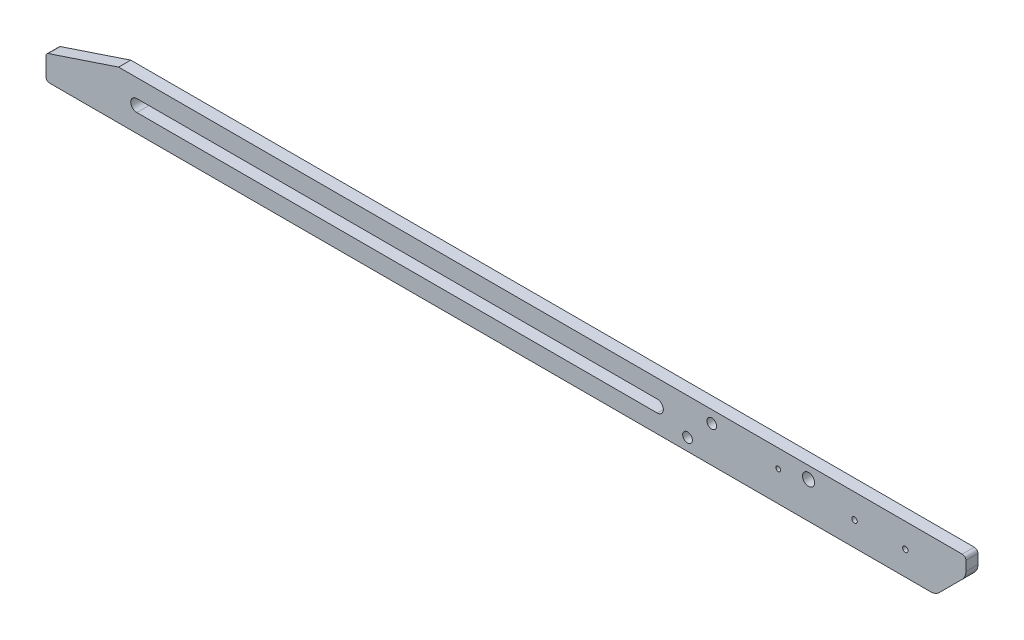
ISO-10303-21;
HEADER;
FILE_DESCRIPTION(('STEP AP214'),'2;1');
FILE_NAME('part.step','',(''),(''),'','','');
FILE_SCHEMA(('AUTOMOTIVE_DESIGN { 1 0 10303 214 1 1 1 1 }'));
ENDSEC;
DATA;
#1=APPLICATION_CONTEXT('core data for automotive mechanical design processes');
#2=APPLICATION_PROTOCOL_DEFINITION('international standard','automotive_design',2000,#1);
#3=PRODUCT_CONTEXT('',#1,'mechanical');
#4=PRODUCT('Part','Part','',(#3));
#5=PRODUCT_RELATED_PRODUCT_CATEGORY('part','',(#4));
#6=PRODUCT_DEFINITION_FORMATION('','',#4);
#7=PRODUCT_DEFINITION_CONTEXT('part definition',#1,'design');
#8=PRODUCT_DEFINITION('design','',#6,#7);
#9=PRODUCT_DEFINITION_SHAPE('','',#8);
#10=(LENGTH_UNIT() NAMED_UNIT(*) SI_UNIT(.MILLI.,.METRE.));
#11=(NAMED_UNIT(*) PLANE_ANGLE_UNIT() SI_UNIT($,.RADIAN.));
#12=(NAMED_UNIT(*) SI_UNIT($,.STERADIAN.) SOLID_ANGLE_UNIT());
#13=UNCERTAINTY_MEASURE_WITH_UNIT(LENGTH_MEASURE(1.E-05),#10,'distance_accuracy_value','');
#14=(GEOMETRIC_REPRESENTATION_CONTEXT(3) GLOBAL_UNCERTAINTY_ASSIGNED_CONTEXT((#13)) GLOBAL_UNIT_ASSIGNED_CONTEXT((#10,
#11,#12)) REPRESENTATION_CONTEXT('',''));
#15=CARTESIAN_POINT('',(0.,0.,0.));
#16=DIRECTION('',(0.,0.,1.));
#17=DIRECTION('',(1.,0.,0.));
#18=AXIS2_PLACEMENT_3D('',#15,#16,#17);
#19=CARTESIAN_POINT('',(0.,0.,10.));
#20=DIRECTION('',(1.,0.,0.));
#21=DIRECTION('',(0.,0.,-1.));
#22=AXIS2_PLACEMENT_3D('',#19,#20,#21);
#23=PLANE('',#22);
#24=DIRECTION('',(0.,-1.,0.));
#25=VECTOR('',#24,1.);
#26=CARTESIAN_POINT('',(0.,0.,0.));
#27=LINE('',#26,#25);
#28=CARTESIAN_POINT('',(0.,17.8377223398316,0.));
#29=VERTEX_POINT('',#28);
#30=CARTESIAN_POINT('',(0.,3.,0.));
#31=VERTEX_POINT('',#30);
#32=EDGE_CURVE('E186',#29,#31,#27,.T.);
#33=ORIENTED_EDGE('',*,*,#32,.T.);
#34=DIRECTION('',(0.,0.,-1.));
#35=VECTOR('',#34,1.);
#36=CARTESIAN_POINT('',(0.,3.,10.));
#37=LINE('',#36,#35);
#38=CARTESIAN_POINT('',(0.,3.,10.));
#39=VERTEX_POINT('',#38);
#40=EDGE_CURVE('E314',#31,#39,#37,.F.);
#41=ORIENTED_EDGE('',*,*,#40,.T.);
#42=DIRECTION('',(0.,-1.,0.));
#43=VECTOR('',#42,1.);
#44=CARTESIAN_POINT('',(0.,0.,10.));
#45=LINE('',#44,#43);
#46=CARTESIAN_POINT('',(0.,17.8377223398316,10.));
#47=VERTEX_POINT('',#46);
#48=EDGE_CURVE('E189',#47,#39,#45,.T.);
#49=ORIENTED_EDGE('',*,*,#48,.F.);
#50=DIRECTION('',(0.,0.,1.));
#51=VECTOR('',#50,1.);
#52=CARTESIAN_POINT('',(0.,17.8377223398316,10.));
#53=LINE('',#52,#51);
#54=EDGE_CURVE('E312',#47,#29,#53,.F.);
#55=ORIENTED_EDGE('',*,*,#54,.T.);
#56=EDGE_LOOP('',(#33,#41,#49,#55));
#57=FACE_BOUND('',#56,.T.);
#58=ADVANCED_FACE('F35',(#57),#23,.F.);
#59=CARTESIAN_POINT('',(0.,0.,10.));
#60=DIRECTION('',(0.,1.,0.));
#61=DIRECTION('',(0.,0.,1.));
#62=AXIS2_PLACEMENT_3D('',#59,#60,#61);
#63=PLANE('',#62);
#64=DIRECTION('',(1.,0.,0.));
#65=VECTOR('',#64,1.);
#66=CARTESIAN_POINT('',(0.,0.,0.));
#67=LINE('',#66,#65);
#68=CARTESIAN_POINT('',(3.,0.,0.));
#69=VERTEX_POINT('',#68);
#70=CARTESIAN_POINT('',(730.857864376269,0.,0.));
#71=VERTEX_POINT('',#70);
#72=EDGE_CURVE('E235',#69,#71,#67,.T.);
#73=ORIENTED_EDGE('',*,*,#72,.T.);
#74=DIRECTION('',(0.,0.,-1.));
#75=VECTOR('',#74,1.);
#76=CARTESIAN_POINT('',(730.857864376269,0.,10.));
#77=LINE('',#76,#75);
#78=CARTESIAN_POINT('',(730.857864376269,0.,10.));
#79=VERTEX_POINT('',#78);
#80=EDGE_CURVE('E220',#71,#79,#77,.F.);
#81=ORIENTED_EDGE('',*,*,#80,.T.);
#82=DIRECTION('',(1.,0.,0.));
#83=VECTOR('',#82,1.);
#84=CARTESIAN_POINT('',(0.,0.,10.));
#85=LINE('',#84,#83);
#86=CARTESIAN_POINT('',(3.,0.,10.));
#87=VERTEX_POINT('',#86);
#88=EDGE_CURVE('E192',#87,#79,#85,.T.);
#89=ORIENTED_EDGE('',*,*,#88,.F.);
#90=DIRECTION('',(0.,0.,-1.));
#91=VECTOR('',#90,1.);
#92=CARTESIAN_POINT('',(3.,0.,10.));
#93=LINE('',#92,#91);
#94=EDGE_CURVE('E244',#87,#69,#93,.T.);
#95=ORIENTED_EDGE('',*,*,#94,.T.);
#96=EDGE_LOOP('',(#73,#81,#89,#95));
#97=FACE_BOUND('',#96,.T.);
#98=ADVANCED_FACE('F241',(#97),#63,.F.);
#99=CARTESIAN_POINT('',(760.,0.,10.));
#100=DIRECTION('',(-1.,0.,0.));
#101=DIRECTION('',(0.,0.,1.));
#102=AXIS2_PLACEMENT_3D('',#99,#100,#101);
#103=PLANE('',#102);
#104=DIRECTION('',(0.,1.,0.));
#105=VECTOR('',#104,1.);
#106=CARTESIAN_POINT('',(760.,0.,10.));
#107=LINE('',#106,#105);
#108=CARTESIAN_POINT('',(760.,29.1421356237311,10.));
#109=VERTEX_POINT('',#108);
#110=CARTESIAN_POINT('',(760.,37.,10.));
#111=VERTEX_POINT('',#110);
#112=EDGE_CURVE('E196',#109,#111,#107,.T.);
#113=ORIENTED_EDGE('',*,*,#112,.F.);
#114=DIRECTION('',(0.,0.,1.));
#115=VECTOR('',#114,1.);
#116=CARTESIAN_POINT('',(760.,29.1421356237311,0.));
#117=LINE('',#116,#115);
#118=CARTESIAN_POINT('',(760.,29.1421356237311,0.));
#119=VERTEX_POINT('',#118);
#120=EDGE_CURVE('E11',#109,#119,#117,.F.);
#121=ORIENTED_EDGE('',*,*,#120,.T.);
#122=DIRECTION('',(0.,1.,0.));
#123=VECTOR('',#122,1.);
#124=CARTESIAN_POINT('',(760.,0.,0.));
#125=LINE('',#124,#123);
#126=CARTESIAN_POINT('',(760.,37.,0.));
#127=VERTEX_POINT('',#126);
#128=EDGE_CURVE('E245',#119,#127,#125,.T.);
#129=ORIENTED_EDGE('',*,*,#128,.T.);
#130=DIRECTION('',(0.,0.,-1.));
#131=VECTOR('',#130,1.);
#132=CARTESIAN_POINT('',(760.,37.,10.));
#133=LINE('',#132,#131);
#134=EDGE_CURVE('E215',#127,#111,#133,.F.);
#135=ORIENTED_EDGE('',*,*,#134,.T.);
#136=EDGE_LOOP('',(#113,#121,#129,#135));
#137=FACE_BOUND('',#136,.T.);
#138=ADVANCED_FACE('F342',(#137),#103,.F.);
#139=CARTESIAN_POINT('',(0.,40.,10.));
#140=DIRECTION('',(0.,-1.,0.));
#141=DIRECTION('',(0.,0.,-1.));
#142=AXIS2_PLACEMENT_3D('',#139,#140,#141);
#143=PLANE('',#142);
#144=DIRECTION('',(-1.,0.,0.));
#145=VECTOR('',#144,1.);
#146=CARTESIAN_POINT('',(0.,40.,10.));
#147=LINE('',#146,#145);
#148=CARTESIAN_POINT('',(757.,40.,10.));
#149=VERTEX_POINT('',#148);
#150=CARTESIAN_POINT('',(60.,40.,10.));
#151=VERTEX_POINT('',#150);
#152=EDGE_CURVE('E198',#149,#151,#147,.T.);
#153=ORIENTED_EDGE('',*,*,#152,.F.);
#154=DIRECTION('',(0.,0.,-1.));
#155=VECTOR('',#154,1.);
#156=CARTESIAN_POINT('',(757.,40.,10.));
#157=LINE('',#156,#155);
#158=CARTESIAN_POINT('',(757.,40.,0.));
#159=VERTEX_POINT('',#158);
#160=EDGE_CURVE('E208',#149,#159,#157,.T.);
#161=ORIENTED_EDGE('',*,*,#160,.T.);
#162=DIRECTION('',(-1.,0.,0.));
#163=VECTOR('',#162,1.);
#164=CARTESIAN_POINT('',(0.,40.,0.));
#165=LINE('',#164,#163);
#166=CARTESIAN_POINT('',(60.,40.,0.));
#167=VERTEX_POINT('',#166);
#168=EDGE_CURVE('E193',#159,#167,#165,.T.);
#169=ORIENTED_EDGE('',*,*,#168,.T.);
#170=DIRECTION('',(0.,0.,1.));
#171=VECTOR('',#170,1.);
#172=CARTESIAN_POINT('',(60.,40.,0.));
#173=LINE('',#172,#171);
#174=EDGE_CURVE('E178',#167,#151,#173,.T.);
#175=ORIENTED_EDGE('',*,*,#174,.T.);
#176=EDGE_LOOP('',(#153,#161,#169,#175));
#177=FACE_BOUND('',#176,.T.);
#178=ADVANCED_FACE('F333',(#177),#143,.F.);
#179=CARTESIAN_POINT('',(0.,0.,10.));
#180=DIRECTION('',(0.,0.,-1.));
#181=DIRECTION('',(-1.,0.,0.));
#182=AXIS2_PLACEMENT_3D('',#179,#180,#181);
#183=PLANE('',#182);
#184=CARTESIAN_POINT('',(710.,20.,10.));
#185=DIRECTION('',(0.,0.,-1.));
#186=DIRECTION('',(-1.,0.,0.));
#187=AXIS2_PLACEMENT_3D('',#184,#185,#186);
#188=CIRCLE('',#187,2.25000000000001);
#189=CARTESIAN_POINT('',(707.75,20.,10.));
#190=VERTEX_POINT('',#189);
#191=EDGE_CURVE('E275',#190,#190,#188,.T.);
#192=ORIENTED_EDGE('',*,*,#191,.T.);
#193=EDGE_LOOP('',(#192));
#194=FACE_BOUND('',#193,.T.);
#195=CARTESIAN_POINT('',(668.,20.,10.));
#196=DIRECTION('',(0.,0.,-1.));
#197=DIRECTION('',(-1.,0.,0.));
#198=AXIS2_PLACEMENT_3D('',#195,#196,#197);
#199=CIRCLE('',#198,2.25000000000001);
#200=CARTESIAN_POINT('',(665.75,20.,10.));
#201=VERTEX_POINT('',#200);
#202=EDGE_CURVE('E264',#201,#201,#199,.T.);
#203=ORIENTED_EDGE('',*,*,#202,.T.);
#204=EDGE_LOOP('',(#203));
#205=FACE_BOUND('',#204,.T.);
#206=CARTESIAN_POINT('',(630.,30.,10.));
#207=DIRECTION('',(0.,0.,-1.));
#208=DIRECTION('',(-1.,0.,0.));
#209=AXIS2_PLACEMENT_3D('',#206,#207,#208);
#210=CIRCLE('',#209,5.00000000000005);
#211=CARTESIAN_POINT('',(625.,30.,10.));
#212=VERTEX_POINT('',#211);
#213=EDGE_CURVE('E261',#212,#212,#210,.T.);
#214=ORIENTED_EDGE('',*,*,#213,.T.);
#215=EDGE_LOOP('',(#214));
#216=FACE_BOUND('',#215,.T.);
#217=CARTESIAN_POINT('',(605.,25.,10.));
#218=DIRECTION('',(0.,0.,-1.));
#219=DIRECTION('',(-1.,0.,0.));
#220=AXIS2_PLACEMENT_3D('',#217,#218,#219);
#221=CIRCLE('',#220,2.);
#222=CARTESIAN_POINT('',(603.,25.,10.));
#223=VERTEX_POINT('',#222);
#224=EDGE_CURVE('E258',#223,#223,#221,.T.);
#225=ORIENTED_EDGE('',*,*,#224,.T.);
#226=EDGE_LOOP('',(#225));
#227=FACE_BOUND('',#226,.T.);
#228=CARTESIAN_POINT('',(550.,30.,10.));
#229=DIRECTION('',(0.,0.,-1.));
#230=DIRECTION('',(-1.,0.,0.));
#231=AXIS2_PLACEMENT_3D('',#228,#229,#230);
#232=CIRCLE('',#231,3.99999999999999);
#233=CARTESIAN_POINT('',(546.,30.,10.));
#234=VERTEX_POINT('',#233);
#235=EDGE_CURVE('E283',#234,#234,#232,.T.);
#236=ORIENTED_EDGE('',*,*,#235,.T.);
#237=EDGE_LOOP('',(#236));
#238=FACE_BOUND('',#237,.T.);
#239=CARTESIAN_POINT('',(530.,10.,10.));
#240=DIRECTION('',(0.,0.,-1.));
#241=DIRECTION('',(-1.,0.,0.));
#242=AXIS2_PLACEMENT_3D('',#239,#240,#241);
#243=CIRCLE('',#242,3.99999999999999);
#244=CARTESIAN_POINT('',(526.,10.,10.));
#245=VERTEX_POINT('',#244);
#246=EDGE_CURVE('E279',#245,#245,#243,.T.);
#247=ORIENTED_EDGE('',*,*,#246,.T.);
#248=EDGE_LOOP('',(#247));
#249=FACE_BOUND('',#248,.T.);
#250=DIRECTION('',(-1.,0.,0.));
#251=VECTOR('',#250,1.);
#252=CARTESIAN_POINT('',(0.,15.,10.));
#253=LINE('',#252,#251);
#254=CARTESIAN_POINT('',(505.,15.0000000000001,10.));
#255=VERTEX_POINT('',#254);
#256=CARTESIAN_POINT('',(75.,15.,10.));
#257=VERTEX_POINT('',#256);
#258=EDGE_CURVE('E144',#255,#257,#253,.T.);
#259=ORIENTED_EDGE('',*,*,#258,.T.);
#260=CARTESIAN_POINT('',(75.,20.,10.));
#261=DIRECTION('',(0.,0.,-1.));
#262=DIRECTION('',(-1.,0.,0.));
#263=AXIS2_PLACEMENT_3D('',#260,#261,#262);
#264=CIRCLE('',#263,5.);
#265=CARTESIAN_POINT('',(75.,25.,10.));
#266=VERTEX_POINT('',#265);
#267=EDGE_CURVE('E170',#257,#266,#264,.T.);
#268=ORIENTED_EDGE('',*,*,#267,.T.);
#269=DIRECTION('',(1.,0.,0.));
#270=VECTOR('',#269,1.);
#271=CARTESIAN_POINT('',(0.,25.,10.));
#272=LINE('',#271,#270);
#273=CARTESIAN_POINT('',(505.,25.0000000000001,10.));
#274=VERTEX_POINT('',#273);
#275=EDGE_CURVE('E168',#266,#274,#272,.T.);
#276=ORIENTED_EDGE('',*,*,#275,.T.);
#277=CARTESIAN_POINT('',(505.,20.0000000000001,10.));
#278=DIRECTION('',(0.,0.,-1.));
#279=DIRECTION('',(-1.,0.,0.));
#280=AXIS2_PLACEMENT_3D('',#277,#278,#279);
#281=CIRCLE('',#280,5.);
#282=EDGE_CURVE('E155',#274,#255,#281,.T.);
#283=ORIENTED_EDGE('',*,*,#282,.T.);
#284=EDGE_LOOP('',(#259,#268,#276,#283));
#285=FACE_BOUND('',#284,.T.);
#286=ORIENTED_EDGE('',*,*,#88,.T.);
#287=CARTESIAN_POINT('',(730.857864376269,10.,10.));
#288=DIRECTION('',(0.,0.,-1.));
#289=DIRECTION('',(-1.,0.,0.));
#290=AXIS2_PLACEMENT_3D('',#287,#288,#289);
#291=CIRCLE('',#290,10.);
#292=CARTESIAN_POINT('',(737.928932188134,2.9289321881345,10.));
#293=VERTEX_POINT('',#292);
#294=EDGE_CURVE('E225',#79,#293,#291,.F.);
#295=ORIENTED_EDGE('',*,*,#294,.T.);
#296=DIRECTION('',(-0.707106781186548,-0.707106781186548,0.));
#297=VECTOR('',#296,1.);
#298=CARTESIAN_POINT('',(760.,25.0000000000001,10.));
#299=LINE('',#298,#297);
#300=CARTESIAN_POINT('',(757.071067811866,22.0710678118656,10.));
#301=VERTEX_POINT('',#300);
#302=EDGE_CURVE('E212',#293,#301,#299,.F.);
#303=ORIENTED_EDGE('',*,*,#302,.T.);
#304=CARTESIAN_POINT('',(750.,29.1421356237311,10.));
#305=DIRECTION('',(0.,0.,-1.));
#306=DIRECTION('',(-1.,0.,0.));
#307=AXIS2_PLACEMENT_3D('',#304,#305,#306);
#308=CIRCLE('',#307,10.);
#309=EDGE_CURVE('E223',#301,#109,#308,.F.);
#310=ORIENTED_EDGE('',*,*,#309,.T.);
#311=ORIENTED_EDGE('',*,*,#112,.T.);
#312=CARTESIAN_POINT('',(757.,37.,10.));
#313=DIRECTION('',(0.,0.,-1.));
#314=DIRECTION('',(-1.,0.,0.));
#315=AXIS2_PLACEMENT_3D('',#312,#313,#314);
#316=CIRCLE('',#315,3.);
#317=EDGE_CURVE('E218',#111,#149,#316,.F.);
#318=ORIENTED_EDGE('',*,*,#317,.T.);
#319=ORIENTED_EDGE('',*,*,#152,.T.);
#320=DIRECTION('',(-0.948683298050514,-0.316227766016838,0.));
#321=VECTOR('',#320,1.);
#322=CARTESIAN_POINT('',(-6.,18.,10.));
#323=LINE('',#322,#321);
#324=CARTESIAN_POINT('',(2.05131670194949,20.6837722339832,10.));
#325=VERTEX_POINT('',#324);
#326=EDGE_CURVE('E181',#151,#325,#323,.T.);
#327=ORIENTED_EDGE('',*,*,#326,.T.);
#328=CARTESIAN_POINT('',(3.,17.8377223398316,10.));
#329=DIRECTION('',(0.,0.,-1.));
#330=DIRECTION('',(-1.,0.,0.));
#331=AXIS2_PLACEMENT_3D('',#328,#329,#330);
#332=CIRCLE('',#331,3.);
#333=EDGE_CURVE('E316',#325,#47,#332,.F.);
#334=ORIENTED_EDGE('',*,*,#333,.T.);
#335=ORIENTED_EDGE('',*,*,#48,.T.);
#336=CARTESIAN_POINT('',(3.,3.,10.));
#337=DIRECTION('',(0.,0.,-1.));
#338=DIRECTION('',(-1.,0.,0.));
#339=AXIS2_PLACEMENT_3D('',#336,#337,#338);
#340=CIRCLE('',#339,3.);
#341=EDGE_CURVE('E318',#39,#87,#340,.F.);
#342=ORIENTED_EDGE('',*,*,#341,.T.);
#343=EDGE_LOOP('',(#286,#295,#303,#310,#311,#318,#319,#327,#334,#335,#342));
#344=FACE_BOUND('',#343,.T.);
#345=ADVANCED_FACE('F166',(#194,#205,#216,#227,#238,#249,#285,#344),#183,.F.);
#346=CARTESIAN_POINT('',(0.,0.,0.));
#347=DIRECTION('',(0.,0.,-1.));
#348=DIRECTION('',(-1.,0.,0.));
#349=AXIS2_PLACEMENT_3D('',#346,#347,#348);
#350=PLANE('',#349);
#351=CARTESIAN_POINT('',(710.,20.,0.));
#352=DIRECTION('',(0.,0.,-1.));
#353=DIRECTION('',(-1.,0.,0.));
#354=AXIS2_PLACEMENT_3D('',#351,#352,#353);
#355=CIRCLE('',#354,2.25000000000001);
#356=CARTESIAN_POINT('',(707.75,20.,0.));
#357=VERTEX_POINT('',#356);
#358=EDGE_CURVE('E206',#357,#357,#355,.T.);
#359=ORIENTED_EDGE('',*,*,#358,.F.);
#360=EDGE_LOOP('',(#359));
#361=FACE_BOUND('',#360,.T.);
#362=CARTESIAN_POINT('',(668.,20.,0.));
#363=DIRECTION('',(0.,0.,-1.));
#364=DIRECTION('',(-1.,0.,0.));
#365=AXIS2_PLACEMENT_3D('',#362,#363,#364);
#366=CIRCLE('',#365,2.25000000000001);
#367=CARTESIAN_POINT('',(665.75,20.,0.));
#368=VERTEX_POINT('',#367);
#369=EDGE_CURVE('E262',#368,#368,#366,.T.);
#370=ORIENTED_EDGE('',*,*,#369,.F.);
#371=EDGE_LOOP('',(#370));
#372=FACE_BOUND('',#371,.T.);
#373=CARTESIAN_POINT('',(630.,30.,0.));
#374=DIRECTION('',(0.,0.,-1.));
#375=DIRECTION('',(-1.,0.,0.));
#376=AXIS2_PLACEMENT_3D('',#373,#374,#375);
#377=CIRCLE('',#376,5.00000000000005);
#378=CARTESIAN_POINT('',(625.,30.,0.));
#379=VERTEX_POINT('',#378);
#380=EDGE_CURVE('E259',#379,#379,#377,.T.);
#381=ORIENTED_EDGE('',*,*,#380,.F.);
#382=EDGE_LOOP('',(#381));
#383=FACE_BOUND('',#382,.T.);
#384=CARTESIAN_POINT('',(605.,25.,0.));
#385=DIRECTION('',(0.,0.,-1.));
#386=DIRECTION('',(-1.,0.,0.));
#387=AXIS2_PLACEMENT_3D('',#384,#385,#386);
#388=CIRCLE('',#387,2.);
#389=CARTESIAN_POINT('',(603.,25.,0.));
#390=VERTEX_POINT('',#389);
#391=EDGE_CURVE('E255',#390,#390,#388,.T.);
#392=ORIENTED_EDGE('',*,*,#391,.F.);
#393=EDGE_LOOP('',(#392));
#394=FACE_BOUND('',#393,.T.);
#395=CARTESIAN_POINT('',(550.,30.,0.));
#396=DIRECTION('',(0.,0.,-1.));
#397=DIRECTION('',(-1.,0.,0.));
#398=AXIS2_PLACEMENT_3D('',#395,#396,#397);
#399=CIRCLE('',#398,3.99999999999999);
#400=CARTESIAN_POINT('',(546.,30.,0.));
#401=VERTEX_POINT('',#400);
#402=EDGE_CURVE('E282',#401,#401,#399,.T.);
#403=ORIENTED_EDGE('',*,*,#402,.F.);
#404=EDGE_LOOP('',(#403));
#405=FACE_BOUND('',#404,.T.);
#406=CARTESIAN_POINT('',(530.,10.,0.));
#407=DIRECTION('',(0.,0.,-1.));
#408=DIRECTION('',(-1.,0.,0.));
#409=AXIS2_PLACEMENT_3D('',#406,#407,#408);
#410=CIRCLE('',#409,3.99999999999999);
#411=CARTESIAN_POINT('',(526.,10.,0.));
#412=VERTEX_POINT('',#411);
#413=EDGE_CURVE('E278',#412,#412,#410,.T.);
#414=ORIENTED_EDGE('',*,*,#413,.F.);
#415=EDGE_LOOP('',(#414));
#416=FACE_BOUND('',#415,.T.);
#417=CARTESIAN_POINT('',(75.,20.,0.));
#418=DIRECTION('',(0.,0.,1.));
#419=DIRECTION('',(1.,0.,0.));
#420=AXIS2_PLACEMENT_3D('',#417,#418,#419);
#421=CIRCLE('',#420,5.);
#422=CARTESIAN_POINT('',(75.,15.,0.));
#423=VERTEX_POINT('',#422);
#424=CARTESIAN_POINT('',(75.,25.,0.));
#425=VERTEX_POINT('',#424);
#426=EDGE_CURVE('E296',#423,#425,#421,.F.);
#427=ORIENTED_EDGE('',*,*,#426,.F.);
#428=DIRECTION('',(1.,0.,0.));
#429=VECTOR('',#428,1.);
#430=CARTESIAN_POINT('',(75.,15.,0.));
#431=LINE('',#430,#429);
#432=CARTESIAN_POINT('',(505.,15.0000000000001,0.));
#433=VERTEX_POINT('',#432);
#434=EDGE_CURVE('E205',#433,#423,#431,.F.);
#435=ORIENTED_EDGE('',*,*,#434,.F.);
#436=CARTESIAN_POINT('',(505.,20.0000000000001,0.));
#437=DIRECTION('',(0.,0.,1.));
#438=DIRECTION('',(1.,0.,0.));
#439=AXIS2_PLACEMENT_3D('',#436,#437,#438);
#440=CIRCLE('',#439,5.);
#441=CARTESIAN_POINT('',(505.,25.0000000000001,0.));
#442=VERTEX_POINT('',#441);
#443=EDGE_CURVE('E162',#442,#433,#440,.F.);
#444=ORIENTED_EDGE('',*,*,#443,.F.);
#445=DIRECTION('',(-1.,0.,0.));
#446=VECTOR('',#445,1.);
#447=CARTESIAN_POINT('',(75.,25.,0.));
#448=LINE('',#447,#446);
#449=EDGE_CURVE('E292',#425,#442,#448,.F.);
#450=ORIENTED_EDGE('',*,*,#449,.F.);
#451=EDGE_LOOP('',(#427,#435,#444,#450));
#452=FACE_BOUND('',#451,.T.);
#453=DIRECTION('',(0.707106781186548,0.707106781186548,0.));
#454=VECTOR('',#453,1.);
#455=CARTESIAN_POINT('',(367.5,-367.5,0.));
#456=LINE('',#455,#454);
#457=CARTESIAN_POINT('',(757.071067811866,22.0710678118656,0.));
#458=VERTEX_POINT('',#457);
#459=CARTESIAN_POINT('',(737.928932188134,2.92893218813456,0.));
#460=VERTEX_POINT('',#459);
#461=EDGE_CURVE('E236',#458,#460,#456,.F.);
#462=ORIENTED_EDGE('',*,*,#461,.T.);
#463=CARTESIAN_POINT('',(730.857864376269,10.,0.));
#464=DIRECTION('',(0.,0.,-1.));
#465=DIRECTION('',(-1.,0.,0.));
#466=AXIS2_PLACEMENT_3D('',#463,#464,#465);
#467=CIRCLE('',#466,10.);
#468=EDGE_CURVE('E43',#460,#71,#467,.T.);
#469=ORIENTED_EDGE('',*,*,#468,.T.);
#470=ORIENTED_EDGE('',*,*,#72,.F.);
#471=CARTESIAN_POINT('',(3.,3.,0.));
#472=DIRECTION('',(0.,0.,-1.));
#473=DIRECTION('',(-1.,0.,0.));
#474=AXIS2_PLACEMENT_3D('',#471,#472,#473);
#475=CIRCLE('',#474,3.);
#476=EDGE_CURVE('E310',#69,#31,#475,.T.);
#477=ORIENTED_EDGE('',*,*,#476,.T.);
#478=ORIENTED_EDGE('',*,*,#32,.F.);
#479=CARTESIAN_POINT('',(3.,17.8377223398316,0.));
#480=DIRECTION('',(0.,0.,-1.));
#481=DIRECTION('',(-1.,0.,0.));
#482=AXIS2_PLACEMENT_3D('',#479,#480,#481);
#483=CIRCLE('',#482,3.);
#484=CARTESIAN_POINT('',(2.05131670194948,20.6837722339832,0.));
#485=VERTEX_POINT('',#484);
#486=EDGE_CURVE('E308',#29,#485,#483,.T.);
#487=ORIENTED_EDGE('',*,*,#486,.T.);
#488=DIRECTION('',(0.948683298050514,0.316227766016838,0.));
#489=VECTOR('',#488,1.);
#490=CARTESIAN_POINT('',(60.,40.,0.));
#491=LINE('',#490,#489);
#492=EDGE_CURVE('E175',#485,#167,#491,.T.);
#493=ORIENTED_EDGE('',*,*,#492,.T.);
#494=ORIENTED_EDGE('',*,*,#168,.F.);
#495=CARTESIAN_POINT('',(757.,37.,0.));
#496=DIRECTION('',(0.,0.,-1.));
#497=DIRECTION('',(-1.,0.,0.));
#498=AXIS2_PLACEMENT_3D('',#495,#496,#497);
#499=CIRCLE('',#498,3.);
#500=EDGE_CURVE('E211',#159,#127,#499,.T.);
#501=ORIENTED_EDGE('',*,*,#500,.T.);
#502=ORIENTED_EDGE('',*,*,#128,.F.);
#503=CARTESIAN_POINT('',(750.,29.1421356237311,0.));
#504=DIRECTION('',(0.,0.,-1.));
#505=DIRECTION('',(-1.,0.,0.));
#506=AXIS2_PLACEMENT_3D('',#503,#504,#505);
#507=CIRCLE('',#506,10.);
#508=EDGE_CURVE('E50',#119,#458,#507,.T.);
#509=ORIENTED_EDGE('',*,*,#508,.T.);
#510=EDGE_LOOP('',(#462,#469,#470,#477,#478,#487,#493,#494,#501,#502,#509));
#511=FACE_BOUND('',#510,.T.);
#512=ADVANCED_FACE('F234',(#361,#372,#383,#394,#405,#416,#452,#511),#350,.T.);
#513=CARTESIAN_POINT('',(60.,40.,0.));
#514=DIRECTION('',(0.316227766016838,-0.948683298050514,0.));
#515=DIRECTION('',(0.948683298050514,0.316227766016838,0.));
#516=AXIS2_PLACEMENT_3D('',#513,#514,#515);
#517=PLANE('',#516);
#518=ORIENTED_EDGE('',*,*,#492,.F.);
#519=DIRECTION('',(0.,0.,1.));
#520=VECTOR('',#519,1.);
#521=CARTESIAN_POINT('',(2.05131670194949,20.6837722339832,0.));
#522=LINE('',#521,#520);
#523=EDGE_CURVE('E251',#485,#325,#522,.T.);
#524=ORIENTED_EDGE('',*,*,#523,.T.);
#525=ORIENTED_EDGE('',*,*,#326,.F.);
#526=ORIENTED_EDGE('',*,*,#174,.F.);
#527=EDGE_LOOP('',(#518,#524,#525,#526));
#528=FACE_BOUND('',#527,.T.);
#529=ADVANCED_FACE('F324',(#528),#517,.F.);
#530=CARTESIAN_POINT('',(75.,20.,-2.50000000007189E-05));
#531=DIRECTION('',(0.,0.,1.));
#532=DIRECTION('',(1.,0.,0.));
#533=AXIS2_PLACEMENT_3D('',#530,#531,#532);
#534=CYLINDRICAL_SURFACE('',#533,5.);
#535=DIRECTION('',(0.,0.,1.));
#536=VECTOR('',#535,1.);
#537=CARTESIAN_POINT('',(75.,15.,-2.50000000007189E-05));
#538=LINE('',#537,#536);
#539=EDGE_CURVE('E150',#423,#257,#538,.T.);
#540=ORIENTED_EDGE('',*,*,#539,.F.);
#541=ORIENTED_EDGE('',*,*,#426,.T.);
#542=DIRECTION('',(0.,0.,1.));
#543=VECTOR('',#542,1.);
#544=CARTESIAN_POINT('',(75.,25.,-2.50000000007189E-05));
#545=LINE('',#544,#543);
#546=EDGE_CURVE('E156',#425,#266,#545,.T.);
#547=ORIENTED_EDGE('',*,*,#546,.T.);
#548=ORIENTED_EDGE('',*,*,#267,.F.);
#549=EDGE_LOOP('',(#540,#541,#547,#548));
#550=FACE_BOUND('',#549,.T.);
#551=ADVANCED_FACE('F402',(#550),#534,.F.);
#552=CARTESIAN_POINT('',(75.,25.,-2.50000000007189E-05));
#553=DIRECTION('',(0.,1.,0.));
#554=DIRECTION('',(-1.,0.,0.));
#555=AXIS2_PLACEMENT_3D('',#552,#553,#554);
#556=PLANE('',#555);
#557=ORIENTED_EDGE('',*,*,#546,.F.);
#558=ORIENTED_EDGE('',*,*,#449,.T.);
#559=DIRECTION('',(0.,0.,1.));
#560=VECTOR('',#559,1.);
#561=CARTESIAN_POINT('',(505.,25.0000000000001,-2.50000000007189E-05));
#562=LINE('',#561,#560);
#563=EDGE_CURVE('E163',#442,#274,#562,.T.);
#564=ORIENTED_EDGE('',*,*,#563,.T.);
#565=ORIENTED_EDGE('',*,*,#275,.F.);
#566=EDGE_LOOP('',(#557,#558,#564,#565));
#567=FACE_BOUND('',#566,.T.);
#568=ADVANCED_FACE('F290',(#567),#556,.F.);
#569=CARTESIAN_POINT('',(505.,20.0000000000001,-2.50000000007189E-05));
#570=DIRECTION('',(0.,0.,1.));
#571=DIRECTION('',(1.,0.,0.));
#572=AXIS2_PLACEMENT_3D('',#569,#570,#571);
#573=CYLINDRICAL_SURFACE('',#572,5.);
#574=ORIENTED_EDGE('',*,*,#563,.F.);
#575=ORIENTED_EDGE('',*,*,#443,.T.);
#576=DIRECTION('',(0.,0.,1.));
#577=VECTOR('',#576,1.);
#578=CARTESIAN_POINT('',(505.,15.0000000000001,-2.50000000007189E-05));
#579=LINE('',#578,#577);
#580=EDGE_CURVE('E148',#433,#255,#579,.T.);
#581=ORIENTED_EDGE('',*,*,#580,.T.);
#582=ORIENTED_EDGE('',*,*,#282,.F.);
#583=EDGE_LOOP('',(#574,#575,#581,#582));
#584=FACE_BOUND('',#583,.T.);
#585=ADVANCED_FACE('F159',(#584),#573,.F.);
#586=CARTESIAN_POINT('',(75.,15.,-2.50000000007189E-05));
#587=DIRECTION('',(0.,-1.,0.));
#588=DIRECTION('',(1.,0.,0.));
#589=AXIS2_PLACEMENT_3D('',#586,#587,#588);
#590=PLANE('',#589);
#591=ORIENTED_EDGE('',*,*,#580,.F.);
#592=ORIENTED_EDGE('',*,*,#434,.T.);
#593=ORIENTED_EDGE('',*,*,#539,.T.);
#594=ORIENTED_EDGE('',*,*,#258,.F.);
#595=EDGE_LOOP('',(#591,#592,#593,#594));
#596=FACE_BOUND('',#595,.T.);
#597=ADVANCED_FACE('F146',(#596),#590,.F.);
#598=CARTESIAN_POINT('',(530.,10.,-2.50000000007189E-05));
#599=DIRECTION('',(0.,0.,1.));
#600=DIRECTION('',(1.,0.,0.));
#601=AXIS2_PLACEMENT_3D('',#598,#599,#600);
#602=CYLINDRICAL_SURFACE('',#601,3.99999999999999);
#603=ORIENTED_EDGE('',*,*,#413,.T.);
#604=EDGE_LOOP('',(#603));
#605=FACE_BOUND('',#604,.T.);
#606=ORIENTED_EDGE('',*,*,#246,.F.);
#607=EDGE_LOOP('',(#606));
#608=FACE_BOUND('',#607,.T.);
#609=ADVANCED_FACE('F395',(#605,#608),#602,.F.);
#610=CARTESIAN_POINT('',(550.,30.,-2.50000000007189E-05));
#611=DIRECTION('',(0.,0.,1.));
#612=DIRECTION('',(1.,0.,0.));
#613=AXIS2_PLACEMENT_3D('',#610,#611,#612);
#614=CYLINDRICAL_SURFACE('',#613,3.99999999999999);
#615=ORIENTED_EDGE('',*,*,#402,.T.);
#616=EDGE_LOOP('',(#615));
#617=FACE_BOUND('',#616,.T.);
#618=ORIENTED_EDGE('',*,*,#235,.F.);
#619=EDGE_LOOP('',(#618));
#620=FACE_BOUND('',#619,.T.);
#621=ADVANCED_FACE('F361',(#617,#620),#614,.F.);
#622=CARTESIAN_POINT('',(3.,3.,10.));
#623=DIRECTION('',(0.,0.,-1.));
#624=DIRECTION('',(-1.,0.,0.));
#625=AXIS2_PLACEMENT_3D('',#622,#623,#624);
#626=CYLINDRICAL_SURFACE('',#625,3.);
#627=ORIENTED_EDGE('',*,*,#341,.F.);
#628=ORIENTED_EDGE('',*,*,#40,.F.);
#629=ORIENTED_EDGE('',*,*,#476,.F.);
#630=ORIENTED_EDGE('',*,*,#94,.F.);
#631=EDGE_LOOP('',(#627,#628,#629,#630));
#632=FACE_BOUND('',#631,.T.);
#633=ADVANCED_FACE('F357',(#632),#626,.T.);
#634=CARTESIAN_POINT('',(3.,17.8377223398316,0.));
#635=DIRECTION('',(0.,0.,1.));
#636=DIRECTION('',(1.,0.,0.));
#637=AXIS2_PLACEMENT_3D('',#634,#635,#636);
#638=CYLINDRICAL_SURFACE('',#637,3.);
#639=ORIENTED_EDGE('',*,*,#486,.F.);
#640=ORIENTED_EDGE('',*,*,#54,.F.);
#641=ORIENTED_EDGE('',*,*,#333,.F.);
#642=ORIENTED_EDGE('',*,*,#523,.F.);
#643=EDGE_LOOP('',(#639,#640,#641,#642));
#644=FACE_BOUND('',#643,.T.);
#645=ADVANCED_FACE('F360',(#644),#638,.T.);
#646=CARTESIAN_POINT('',(760.,25.0000000000001,10.));
#647=DIRECTION('',(-0.707106781186548,0.707106781186548,0.));
#648=DIRECTION('',(0.,0.,-1.));
#649=AXIS2_PLACEMENT_3D('',#646,#647,#648);
#650=PLANE('',#649);
#651=ORIENTED_EDGE('',*,*,#302,.F.);
#652=DIRECTION('',(0.,0.,1.));
#653=VECTOR('',#652,1.);
#654=CARTESIAN_POINT('',(737.928932188134,2.9289321881345,0.));
#655=LINE('',#654,#653);
#656=EDGE_CURVE('E57',#293,#460,#655,.F.);
#657=ORIENTED_EDGE('',*,*,#656,.T.);
#658=ORIENTED_EDGE('',*,*,#461,.F.);
#659=DIRECTION('',(0.,0.,-1.));
#660=VECTOR('',#659,1.);
#661=CARTESIAN_POINT('',(757.071067811866,22.0710678118656,10.));
#662=LINE('',#661,#660);
#663=EDGE_CURVE('E227',#458,#301,#662,.F.);
#664=ORIENTED_EDGE('',*,*,#663,.T.);
#665=EDGE_LOOP('',(#651,#657,#658,#664));
#666=FACE_BOUND('',#665,.T.);
#667=ADVANCED_FACE('F249',(#666),#650,.F.);
#668=CARTESIAN_POINT('',(605.,25.,-2.50000000007189E-05));
#669=DIRECTION('',(0.,0.,1.));
#670=DIRECTION('',(1.,0.,0.));
#671=AXIS2_PLACEMENT_3D('',#668,#669,#670);
#672=CYLINDRICAL_SURFACE('',#671,2.);
#673=ORIENTED_EDGE('',*,*,#391,.T.);
#674=EDGE_LOOP('',(#673));
#675=FACE_BOUND('',#674,.T.);
#676=ORIENTED_EDGE('',*,*,#224,.F.);
#677=EDGE_LOOP('',(#676));
#678=FACE_BOUND('',#677,.T.);
#679=ADVANCED_FACE('F370',(#675,#678),#672,.F.);
#680=CARTESIAN_POINT('',(630.,30.,-2.50000000007189E-05));
#681=DIRECTION('',(0.,0.,1.));
#682=DIRECTION('',(1.,0.,0.));
#683=AXIS2_PLACEMENT_3D('',#680,#681,#682);
#684=CYLINDRICAL_SURFACE('',#683,5.00000000000005);
#685=ORIENTED_EDGE('',*,*,#380,.T.);
#686=EDGE_LOOP('',(#685));
#687=FACE_BOUND('',#686,.T.);
#688=ORIENTED_EDGE('',*,*,#213,.F.);
#689=EDGE_LOOP('',(#688));
#690=FACE_BOUND('',#689,.T.);
#691=ADVANCED_FACE('F382',(#687,#690),#684,.F.);
#692=CARTESIAN_POINT('',(668.,20.,-2.50000000007189E-05));
#693=DIRECTION('',(0.,0.,1.));
#694=DIRECTION('',(1.,0.,0.));
#695=AXIS2_PLACEMENT_3D('',#692,#693,#694);
#696=CYLINDRICAL_SURFACE('',#695,2.25000000000001);
#697=ORIENTED_EDGE('',*,*,#369,.T.);
#698=EDGE_LOOP('',(#697));
#699=FACE_BOUND('',#698,.T.);
#700=ORIENTED_EDGE('',*,*,#202,.F.);
#701=EDGE_LOOP('',(#700));
#702=FACE_BOUND('',#701,.T.);
#703=ADVANCED_FACE('F376',(#699,#702),#696,.F.);
#704=CARTESIAN_POINT('',(710.,20.,-2.50000000007189E-05));
#705=DIRECTION('',(0.,0.,1.));
#706=DIRECTION('',(1.,0.,0.));
#707=AXIS2_PLACEMENT_3D('',#704,#705,#706);
#708=CYLINDRICAL_SURFACE('',#707,2.25000000000001);
#709=ORIENTED_EDGE('',*,*,#358,.T.);
#710=EDGE_LOOP('',(#709));
#711=FACE_BOUND('',#710,.T.);
#712=ORIENTED_EDGE('',*,*,#191,.F.);
#713=EDGE_LOOP('',(#712));
#714=FACE_BOUND('',#713,.T.);
#715=ADVANCED_FACE('F372',(#711,#714),#708,.F.);
#716=CARTESIAN_POINT('',(757.,37.,10.));
#717=DIRECTION('',(0.,0.,-1.));
#718=DIRECTION('',(-1.,0.,0.));
#719=AXIS2_PLACEMENT_3D('',#716,#717,#718);
#720=CYLINDRICAL_SURFACE('',#719,3.);
#721=ORIENTED_EDGE('',*,*,#317,.F.);
#722=ORIENTED_EDGE('',*,*,#134,.F.);
#723=ORIENTED_EDGE('',*,*,#500,.F.);
#724=ORIENTED_EDGE('',*,*,#160,.F.);
#725=EDGE_LOOP('',(#721,#722,#723,#724));
#726=FACE_BOUND('',#725,.T.);
#727=ADVANCED_FACE('F336',(#726),#720,.T.);
#728=CARTESIAN_POINT('',(730.857864376269,10.,10.));
#729=DIRECTION('',(0.,0.,1.));
#730=DIRECTION('',(1.,0.,0.));
#731=AXIS2_PLACEMENT_3D('',#728,#729,#730);
#732=CYLINDRICAL_SURFACE('',#731,10.);
#733=ORIENTED_EDGE('',*,*,#468,.F.);
#734=ORIENTED_EDGE('',*,*,#656,.F.);
#735=ORIENTED_EDGE('',*,*,#294,.F.);
#736=ORIENTED_EDGE('',*,*,#80,.F.);
#737=EDGE_LOOP('',(#733,#734,#735,#736));
#738=FACE_BOUND('',#737,.T.);
#739=ADVANCED_FACE('F246',(#738),#732,.T.);
#740=CARTESIAN_POINT('',(750.,29.1421356237311,10.));
#741=DIRECTION('',(0.,0.,-1.));
#742=DIRECTION('',(-1.,0.,0.));
#743=AXIS2_PLACEMENT_3D('',#740,#741,#742);
#744=CYLINDRICAL_SURFACE('',#743,10.);
#745=ORIENTED_EDGE('',*,*,#309,.F.);
#746=ORIENTED_EDGE('',*,*,#663,.F.);
#747=ORIENTED_EDGE('',*,*,#508,.F.);
#748=ORIENTED_EDGE('',*,*,#120,.F.);
#749=EDGE_LOOP('',(#745,#746,#747,#748));
#750=FACE_BOUND('',#749,.T.);
#751=ADVANCED_FACE('F37',(#750),#744,.T.);
#752=CLOSED_SHELL('',(#58,#98,#138,#178,#345,#512,#529,#551,#568,#585,#597,#609,#621,#633,#645,
#667,#679,#691,#703,#715,#727,#739,#751));
#753=MANIFOLD_SOLID_BREP('B2',#752);
#754=ADVANCED_BREP_SHAPE_REPRESENTATION('',(#18,#753),#14);
#755=SHAPE_DEFINITION_REPRESENTATION(#9,#754);
ENDSEC;
END-ISO-10303-21;
